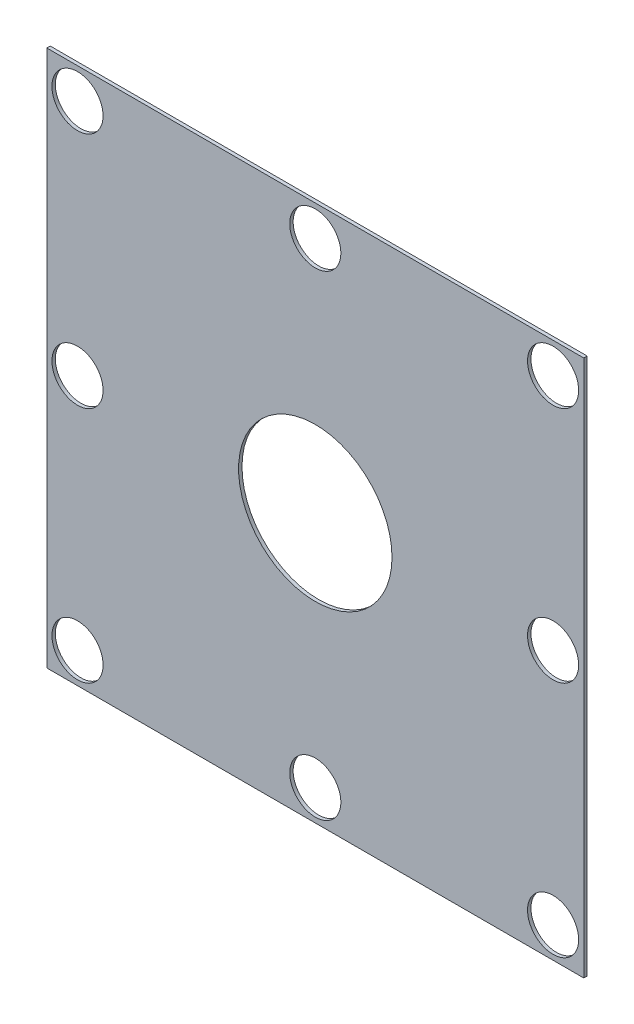
ISO-10303-21;
HEADER;
FILE_DESCRIPTION(('STEP AP214'),'2;1');
FILE_NAME('part.step','',(''),(''),'','','');
FILE_SCHEMA(('AUTOMOTIVE_DESIGN { 1 0 10303 214 1 1 1 1 }'));
ENDSEC;
DATA;
#1=APPLICATION_CONTEXT('core data for automotive mechanical design processes');
#2=APPLICATION_PROTOCOL_DEFINITION('international standard','automotive_design',2000,#1);
#3=PRODUCT_CONTEXT('',#1,'mechanical');
#4=PRODUCT('Part','Part','',(#3));
#5=PRODUCT_RELATED_PRODUCT_CATEGORY('part','',(#4));
#6=PRODUCT_DEFINITION_FORMATION('','',#4);
#7=PRODUCT_DEFINITION_CONTEXT('part definition',#1,'design');
#8=PRODUCT_DEFINITION('design','',#6,#7);
#9=PRODUCT_DEFINITION_SHAPE('','',#8);
#10=(LENGTH_UNIT() NAMED_UNIT(*) SI_UNIT(.MILLI.,.METRE.));
#11=(NAMED_UNIT(*) PLANE_ANGLE_UNIT() SI_UNIT($,.RADIAN.));
#12=(NAMED_UNIT(*) SI_UNIT($,.STERADIAN.) SOLID_ANGLE_UNIT());
#13=UNCERTAINTY_MEASURE_WITH_UNIT(LENGTH_MEASURE(1.E-05),#10,'distance_accuracy_value','');
#14=(GEOMETRIC_REPRESENTATION_CONTEXT(3) GLOBAL_UNCERTAINTY_ASSIGNED_CONTEXT((#13)) GLOBAL_UNIT_ASSIGNED_CONTEXT((#10,
#11,#12)) REPRESENTATION_CONTEXT('',''));
#15=CARTESIAN_POINT('',(0.,0.,0.));
#16=DIRECTION('',(0.,0.,1.));
#17=DIRECTION('',(1.,0.,0.));
#18=AXIS2_PLACEMENT_3D('',#15,#16,#17);
#19=CARTESIAN_POINT('',(0.,0.,0.2));
#20=DIRECTION('',(1.,0.,0.));
#21=DIRECTION('',(0.,0.,-1.));
#22=AXIS2_PLACEMENT_3D('',#19,#20,#21);
#23=PLANE('',#22);
#24=DIRECTION('',(0.,-1.,0.));
#25=VECTOR('',#24,1.);
#26=CARTESIAN_POINT('',(0.,0.,0.));
#27=LINE('',#26,#25);
#28=CARTESIAN_POINT('',(0.,31.5,0.));
#29=VERTEX_POINT('',#28);
#30=CARTESIAN_POINT('',(0.,0.,0.));
#31=VERTEX_POINT('',#30);
#32=EDGE_CURVE('E103',#29,#31,#27,.T.);
#33=ORIENTED_EDGE('',*,*,#32,.T.);
#34=DIRECTION('',(0.,0.,-1.));
#35=VECTOR('',#34,1.);
#36=CARTESIAN_POINT('',(0.,0.,0.2));
#37=LINE('',#36,#35);
#38=CARTESIAN_POINT('',(0.,0.,0.2));
#39=VERTEX_POINT('',#38);
#40=EDGE_CURVE('E11',#39,#31,#37,.T.);
#41=ORIENTED_EDGE('',*,*,#40,.F.);
#42=DIRECTION('',(0.,-1.,0.));
#43=VECTOR('',#42,1.);
#44=CARTESIAN_POINT('',(0.,0.,0.2));
#45=LINE('',#44,#43);
#46=CARTESIAN_POINT('',(0.,31.5,0.2));
#47=VERTEX_POINT('',#46);
#48=EDGE_CURVE('E90',#47,#39,#45,.T.);
#49=ORIENTED_EDGE('',*,*,#48,.F.);
#50=DIRECTION('',(0.,0.,-1.));
#51=VECTOR('',#50,1.);
#52=CARTESIAN_POINT('',(0.,31.5,0.2));
#53=LINE('',#52,#51);
#54=EDGE_CURVE('E99',#47,#29,#53,.T.);
#55=ORIENTED_EDGE('',*,*,#54,.T.);
#56=EDGE_LOOP('',(#33,#41,#49,#55));
#57=FACE_BOUND('',#56,.T.);
#58=ADVANCED_FACE('F38',(#57),#23,.F.);
#59=CARTESIAN_POINT('',(0.,0.,0.2));
#60=DIRECTION('',(0.,1.,0.));
#61=DIRECTION('',(0.,0.,1.));
#62=AXIS2_PLACEMENT_3D('',#59,#60,#61);
#63=PLANE('',#62);
#64=DIRECTION('',(1.,0.,0.));
#65=VECTOR('',#64,1.);
#66=CARTESIAN_POINT('',(0.,0.,0.));
#67=LINE('',#66,#65);
#68=CARTESIAN_POINT('',(31.5,0.,0.));
#69=VERTEX_POINT('',#68);
#70=EDGE_CURVE('E94',#31,#69,#67,.T.);
#71=ORIENTED_EDGE('',*,*,#70,.T.);
#72=DIRECTION('',(0.,0.,-1.));
#73=VECTOR('',#72,1.);
#74=CARTESIAN_POINT('',(31.5,0.,0.2));
#75=LINE('',#74,#73);
#76=CARTESIAN_POINT('',(31.5,0.,0.2));
#77=VERTEX_POINT('',#76);
#78=EDGE_CURVE('E47',#77,#69,#75,.T.);
#79=ORIENTED_EDGE('',*,*,#78,.F.);
#80=DIRECTION('',(1.,0.,0.));
#81=VECTOR('',#80,1.);
#82=CARTESIAN_POINT('',(0.,0.,0.2));
#83=LINE('',#82,#81);
#84=EDGE_CURVE('E85',#39,#77,#83,.T.);
#85=ORIENTED_EDGE('',*,*,#84,.F.);
#86=ORIENTED_EDGE('',*,*,#40,.T.);
#87=EDGE_LOOP('',(#71,#79,#85,#86));
#88=FACE_BOUND('',#87,.T.);
#89=ADVANCED_FACE('F93',(#88),#63,.F.);
#90=CARTESIAN_POINT('',(31.5,0.,0.2));
#91=DIRECTION('',(-1.,0.,0.));
#92=DIRECTION('',(0.,0.,1.));
#93=AXIS2_PLACEMENT_3D('',#90,#91,#92);
#94=PLANE('',#93);
#95=DIRECTION('',(0.,1.,0.));
#96=VECTOR('',#95,1.);
#97=CARTESIAN_POINT('',(31.5,0.,0.));
#98=LINE('',#97,#96);
#99=CARTESIAN_POINT('',(31.5,31.5,0.));
#100=VERTEX_POINT('',#99);
#101=EDGE_CURVE('E72',#69,#100,#98,.T.);
#102=ORIENTED_EDGE('',*,*,#101,.T.);
#103=DIRECTION('',(0.,0.,-1.));
#104=VECTOR('',#103,1.);
#105=CARTESIAN_POINT('',(31.5,31.5,0.2));
#106=LINE('',#105,#104);
#107=CARTESIAN_POINT('',(31.5,31.5,0.2));
#108=VERTEX_POINT('',#107);
#109=EDGE_CURVE('E95',#108,#100,#106,.T.);
#110=ORIENTED_EDGE('',*,*,#109,.F.);
#111=DIRECTION('',(0.,1.,0.));
#112=VECTOR('',#111,1.);
#113=CARTESIAN_POINT('',(31.5,0.,0.2));
#114=LINE('',#113,#112);
#115=EDGE_CURVE('E88',#77,#108,#114,.T.);
#116=ORIENTED_EDGE('',*,*,#115,.F.);
#117=ORIENTED_EDGE('',*,*,#78,.T.);
#118=EDGE_LOOP('',(#102,#110,#116,#117));
#119=FACE_BOUND('',#118,.T.);
#120=ADVANCED_FACE('F97',(#119),#94,.F.);
#121=CARTESIAN_POINT('',(0.,31.5,0.2));
#122=DIRECTION('',(0.,-1.,0.));
#123=DIRECTION('',(0.,0.,-1.));
#124=AXIS2_PLACEMENT_3D('',#121,#122,#123);
#125=PLANE('',#124);
#126=DIRECTION('',(-1.,0.,0.));
#127=VECTOR('',#126,1.);
#128=CARTESIAN_POINT('',(0.,31.5,0.));
#129=LINE('',#128,#127);
#130=EDGE_CURVE('E78',#100,#29,#129,.T.);
#131=ORIENTED_EDGE('',*,*,#130,.T.);
#132=ORIENTED_EDGE('',*,*,#54,.F.);
#133=DIRECTION('',(-1.,0.,0.));
#134=VECTOR('',#133,1.);
#135=CARTESIAN_POINT('',(0.,31.5,0.2));
#136=LINE('',#135,#134);
#137=EDGE_CURVE('E55',#108,#47,#136,.T.);
#138=ORIENTED_EDGE('',*,*,#137,.F.);
#139=ORIENTED_EDGE('',*,*,#109,.T.);
#140=EDGE_LOOP('',(#131,#132,#138,#139));
#141=FACE_BOUND('',#140,.T.);
#142=ADVANCED_FACE('F110',(#141),#125,.F.);
#143=CARTESIAN_POINT('',(0.,0.,0.2));
#144=DIRECTION('',(0.,0.,-1.));
#145=DIRECTION('',(-1.,0.,0.));
#146=AXIS2_PLACEMENT_3D('',#143,#144,#145);
#147=PLANE('',#146);
#148=CARTESIAN_POINT('',(15.75,29.7,0.2));
#149=DIRECTION('',(0.,0.,1.));
#150=DIRECTION('',(1.,0.,0.));
#151=AXIS2_PLACEMENT_3D('',#148,#149,#150);
#152=CIRCLE('',#151,1.5);
#153=CARTESIAN_POINT('',(17.25,29.7,0.2));
#154=VERTEX_POINT('',#153);
#155=EDGE_CURVE('E132',#154,#154,#152,.T.);
#156=ORIENTED_EDGE('',*,*,#155,.F.);
#157=EDGE_LOOP('',(#156));
#158=FACE_BOUND('',#157,.T.);
#159=CARTESIAN_POINT('',(1.8,15.75,0.2));
#160=DIRECTION('',(0.,0.,1.));
#161=DIRECTION('',(1.,0.,0.));
#162=AXIS2_PLACEMENT_3D('',#159,#160,#161);
#163=CIRCLE('',#162,1.5);
#164=CARTESIAN_POINT('',(3.3,15.75,0.2));
#165=VERTEX_POINT('',#164);
#166=EDGE_CURVE('E139',#165,#165,#163,.T.);
#167=ORIENTED_EDGE('',*,*,#166,.F.);
#168=EDGE_LOOP('',(#167));
#169=FACE_BOUND('',#168,.T.);
#170=CARTESIAN_POINT('',(15.75,1.8,0.2));
#171=DIRECTION('',(0.,0.,1.));
#172=DIRECTION('',(1.,0.,0.));
#173=AXIS2_PLACEMENT_3D('',#170,#171,#172);
#174=CIRCLE('',#173,1.5);
#175=CARTESIAN_POINT('',(17.25,1.8,0.2));
#176=VERTEX_POINT('',#175);
#177=EDGE_CURVE('E126',#176,#176,#174,.T.);
#178=ORIENTED_EDGE('',*,*,#177,.F.);
#179=EDGE_LOOP('',(#178));
#180=FACE_BOUND('',#179,.T.);
#181=CARTESIAN_POINT('',(1.8,29.7,0.2));
#182=DIRECTION('',(0.,0.,1.));
#183=DIRECTION('',(1.,0.,0.));
#184=AXIS2_PLACEMENT_3D('',#181,#182,#183);
#185=CIRCLE('',#184,1.5);
#186=CARTESIAN_POINT('',(3.3,29.7,0.2));
#187=VERTEX_POINT('',#186);
#188=EDGE_CURVE('E162',#187,#187,#185,.T.);
#189=ORIENTED_EDGE('',*,*,#188,.F.);
#190=EDGE_LOOP('',(#189));
#191=FACE_BOUND('',#190,.T.);
#192=CARTESIAN_POINT('',(29.7,29.6999999999996,0.2));
#193=DIRECTION('',(0.,0.,1.));
#194=DIRECTION('',(1.,0.,0.));
#195=AXIS2_PLACEMENT_3D('',#192,#193,#194);
#196=CIRCLE('',#195,1.49999999999934);
#197=CARTESIAN_POINT('',(31.1999999999994,29.6999999999996,0.2));
#198=VERTEX_POINT('',#197);
#199=EDGE_CURVE('E156',#198,#198,#196,.T.);
#200=ORIENTED_EDGE('',*,*,#199,.F.);
#201=EDGE_LOOP('',(#200));
#202=FACE_BOUND('',#201,.T.);
#203=CARTESIAN_POINT('',(29.6999999999997,1.79999999999959,0.2));
#204=DIRECTION('',(0.,0.,1.));
#205=DIRECTION('',(1.,0.,0.));
#206=AXIS2_PLACEMENT_3D('',#203,#204,#205);
#207=CIRCLE('',#206,1.49999999999923);
#208=CARTESIAN_POINT('',(31.1999999999989,1.79999999999959,0.2));
#209=VERTEX_POINT('',#208);
#210=EDGE_CURVE('E150',#209,#209,#207,.T.);
#211=ORIENTED_EDGE('',*,*,#210,.F.);
#212=EDGE_LOOP('',(#211));
#213=FACE_BOUND('',#212,.T.);
#214=CARTESIAN_POINT('',(1.79999999999965,1.79999999999994,0.2));
#215=DIRECTION('',(0.,0.,1.));
#216=DIRECTION('',(1.,0.,0.));
#217=AXIS2_PLACEMENT_3D('',#214,#215,#216);
#218=CIRCLE('',#217,1.50000000000002);
#219=CARTESIAN_POINT('',(3.29999999999967,1.79999999999994,0.2));
#220=VERTEX_POINT('',#219);
#221=EDGE_CURVE('E144',#220,#220,#218,.T.);
#222=ORIENTED_EDGE('',*,*,#221,.F.);
#223=EDGE_LOOP('',(#222));
#224=FACE_BOUND('',#223,.T.);
#225=CARTESIAN_POINT('',(29.7,15.75,0.2));
#226=DIRECTION('',(0.,0.,1.));
#227=DIRECTION('',(1.,0.,0.));
#228=AXIS2_PLACEMENT_3D('',#225,#226,#227);
#229=CIRCLE('',#228,1.5);
#230=CARTESIAN_POINT('',(31.2,15.75,0.2));
#231=VERTEX_POINT('',#230);
#232=EDGE_CURVE('E120',#231,#231,#229,.T.);
#233=ORIENTED_EDGE('',*,*,#232,.F.);
#234=EDGE_LOOP('',(#233));
#235=FACE_BOUND('',#234,.T.);
#236=CARTESIAN_POINT('',(15.75,15.75,0.2));
#237=DIRECTION('',(0.,0.,1.));
#238=DIRECTION('',(1.,0.,0.));
#239=AXIS2_PLACEMENT_3D('',#236,#237,#238);
#240=CIRCLE('',#239,4.5);
#241=CARTESIAN_POINT('',(20.25,15.75,0.2));
#242=VERTEX_POINT('',#241);
#243=EDGE_CURVE('E116',#242,#242,#240,.T.);
#244=ORIENTED_EDGE('',*,*,#243,.F.);
#245=EDGE_LOOP('',(#244));
#246=FACE_BOUND('',#245,.T.);
#247=ORIENTED_EDGE('',*,*,#48,.T.);
#248=ORIENTED_EDGE('',*,*,#84,.T.);
#249=ORIENTED_EDGE('',*,*,#115,.T.);
#250=ORIENTED_EDGE('',*,*,#137,.T.);
#251=EDGE_LOOP('',(#247,#248,#249,#250));
#252=FACE_BOUND('',#251,.T.);
#253=ADVANCED_FACE('F86',(#158,#169,#180,#191,#202,#213,#224,#235,#246,#252),#147,.F.);
#254=CARTESIAN_POINT('',(0.,0.,0.));
#255=DIRECTION('',(0.,0.,-1.));
#256=DIRECTION('',(-1.,0.,0.));
#257=AXIS2_PLACEMENT_3D('',#254,#255,#256);
#258=PLANE('',#257);
#259=CARTESIAN_POINT('',(15.75,29.7,0.));
#260=DIRECTION('',(0.,0.,1.));
#261=DIRECTION('',(1.,0.,0.));
#262=AXIS2_PLACEMENT_3D('',#259,#260,#261);
#263=CIRCLE('',#262,1.5);
#264=CARTESIAN_POINT('',(17.25,29.7,0.));
#265=VERTEX_POINT('',#264);
#266=EDGE_CURVE('E135',#265,#265,#263,.T.);
#267=ORIENTED_EDGE('',*,*,#266,.T.);
#268=EDGE_LOOP('',(#267));
#269=FACE_BOUND('',#268,.T.);
#270=CARTESIAN_POINT('',(1.8,15.75,0.));
#271=DIRECTION('',(0.,0.,1.));
#272=DIRECTION('',(1.,0.,0.));
#273=AXIS2_PLACEMENT_3D('',#270,#271,#272);
#274=CIRCLE('',#273,1.5);
#275=CARTESIAN_POINT('',(3.3,15.75,0.));
#276=VERTEX_POINT('',#275);
#277=EDGE_CURVE('E129',#276,#276,#274,.T.);
#278=ORIENTED_EDGE('',*,*,#277,.T.);
#279=EDGE_LOOP('',(#278));
#280=FACE_BOUND('',#279,.T.);
#281=CARTESIAN_POINT('',(15.75,1.8,0.));
#282=DIRECTION('',(0.,0.,1.));
#283=DIRECTION('',(1.,0.,0.));
#284=AXIS2_PLACEMENT_3D('',#281,#282,#283);
#285=CIRCLE('',#284,1.5);
#286=CARTESIAN_POINT('',(17.25,1.8,0.));
#287=VERTEX_POINT('',#286);
#288=EDGE_CURVE('E123',#287,#287,#285,.T.);
#289=ORIENTED_EDGE('',*,*,#288,.T.);
#290=EDGE_LOOP('',(#289));
#291=FACE_BOUND('',#290,.T.);
#292=CARTESIAN_POINT('',(1.8,29.7,0.));
#293=DIRECTION('',(0.,0.,1.));
#294=DIRECTION('',(1.,0.,0.));
#295=AXIS2_PLACEMENT_3D('',#292,#293,#294);
#296=CIRCLE('',#295,1.5);
#297=CARTESIAN_POINT('',(3.3,29.7,0.));
#298=VERTEX_POINT('',#297);
#299=EDGE_CURVE('E136',#298,#298,#296,.T.);
#300=ORIENTED_EDGE('',*,*,#299,.T.);
#301=EDGE_LOOP('',(#300));
#302=FACE_BOUND('',#301,.T.);
#303=CARTESIAN_POINT('',(29.7,29.6999999999996,0.));
#304=DIRECTION('',(0.,0.,1.));
#305=DIRECTION('',(1.,0.,0.));
#306=AXIS2_PLACEMENT_3D('',#303,#304,#305);
#307=CIRCLE('',#306,1.49999999999934);
#308=CARTESIAN_POINT('',(31.1999999999994,29.6999999999996,0.));
#309=VERTEX_POINT('',#308);
#310=EDGE_CURVE('E159',#309,#309,#307,.T.);
#311=ORIENTED_EDGE('',*,*,#310,.T.);
#312=EDGE_LOOP('',(#311));
#313=FACE_BOUND('',#312,.T.);
#314=CARTESIAN_POINT('',(29.6999999999997,1.79999999999959,0.));
#315=DIRECTION('',(0.,0.,1.));
#316=DIRECTION('',(1.,0.,0.));
#317=AXIS2_PLACEMENT_3D('',#314,#315,#316);
#318=CIRCLE('',#317,1.49999999999923);
#319=CARTESIAN_POINT('',(31.1999999999989,1.79999999999959,0.));
#320=VERTEX_POINT('',#319);
#321=EDGE_CURVE('E153',#320,#320,#318,.T.);
#322=ORIENTED_EDGE('',*,*,#321,.T.);
#323=EDGE_LOOP('',(#322));
#324=FACE_BOUND('',#323,.T.);
#325=CARTESIAN_POINT('',(1.79999999999965,1.79999999999994,0.));
#326=DIRECTION('',(0.,0.,1.));
#327=DIRECTION('',(1.,0.,0.));
#328=AXIS2_PLACEMENT_3D('',#325,#326,#327);
#329=CIRCLE('',#328,1.50000000000002);
#330=CARTESIAN_POINT('',(3.29999999999967,1.79999999999994,0.));
#331=VERTEX_POINT('',#330);
#332=EDGE_CURVE('E147',#331,#331,#329,.T.);
#333=ORIENTED_EDGE('',*,*,#332,.T.);
#334=EDGE_LOOP('',(#333));
#335=FACE_BOUND('',#334,.T.);
#336=CARTESIAN_POINT('',(29.7,15.75,0.));
#337=DIRECTION('',(0.,0.,1.));
#338=DIRECTION('',(1.,0.,0.));
#339=AXIS2_PLACEMENT_3D('',#336,#337,#338);
#340=CIRCLE('',#339,1.5);
#341=CARTESIAN_POINT('',(31.2,15.75,0.));
#342=VERTEX_POINT('',#341);
#343=EDGE_CURVE('E119',#342,#342,#340,.T.);
#344=ORIENTED_EDGE('',*,*,#343,.T.);
#345=EDGE_LOOP('',(#344));
#346=FACE_BOUND('',#345,.T.);
#347=CARTESIAN_POINT('',(15.75,15.75,0.));
#348=DIRECTION('',(0.,0.,-1.));
#349=DIRECTION('',(-1.,0.,0.));
#350=AXIS2_PLACEMENT_3D('',#347,#348,#349);
#351=CIRCLE('',#350,4.5);
#352=CARTESIAN_POINT('',(11.25,15.75,0.));
#353=VERTEX_POINT('',#352);
#354=EDGE_CURVE('E41',#353,#353,#351,.T.);
#355=ORIENTED_EDGE('',*,*,#354,.F.);
#356=EDGE_LOOP('',(#355));
#357=FACE_BOUND('',#356,.T.);
#358=ORIENTED_EDGE('',*,*,#32,.F.);
#359=ORIENTED_EDGE('',*,*,#130,.F.);
#360=ORIENTED_EDGE('',*,*,#101,.F.);
#361=ORIENTED_EDGE('',*,*,#70,.F.);
#362=EDGE_LOOP('',(#358,#359,#360,#361));
#363=FACE_BOUND('',#362,.T.);
#364=ADVANCED_FACE('F113',(#269,#280,#291,#302,#313,#324,#335,#346,#357,#363),#258,.T.);
#365=CARTESIAN_POINT('',(15.75,15.75,-9.8));
#366=DIRECTION('',(0.,0.,1.));
#367=DIRECTION('',(1.,0.,0.));
#368=AXIS2_PLACEMENT_3D('',#365,#366,#367);
#369=CYLINDRICAL_SURFACE('',#368,4.5);
#370=ORIENTED_EDGE('',*,*,#354,.T.);
#371=EDGE_LOOP('',(#370));
#372=FACE_BOUND('',#371,.T.);
#373=ORIENTED_EDGE('',*,*,#243,.T.);
#374=EDGE_LOOP('',(#373));
#375=FACE_BOUND('',#374,.T.);
#376=ADVANCED_FACE('F192',(#372,#375),#369,.F.);
#377=CARTESIAN_POINT('',(29.7,15.75,0.));
#378=DIRECTION('',(0.,0.,1.));
#379=DIRECTION('',(1.,0.,0.));
#380=AXIS2_PLACEMENT_3D('',#377,#378,#379);
#381=CYLINDRICAL_SURFACE('',#380,1.5);
#382=ORIENTED_EDGE('',*,*,#343,.F.);
#383=EDGE_LOOP('',(#382));
#384=FACE_BOUND('',#383,.T.);
#385=ORIENTED_EDGE('',*,*,#232,.T.);
#386=EDGE_LOOP('',(#385));
#387=FACE_BOUND('',#386,.T.);
#388=ADVANCED_FACE('F194',(#384,#387),#381,.F.);
#389=CARTESIAN_POINT('',(1.79999999999965,1.79999999999994,0.));
#390=DIRECTION('',(0.,0.,1.));
#391=DIRECTION('',(1.,0.,0.));
#392=AXIS2_PLACEMENT_3D('',#389,#390,#391);
#393=CYLINDRICAL_SURFACE('',#392,1.50000000000002);
#394=ORIENTED_EDGE('',*,*,#332,.F.);
#395=EDGE_LOOP('',(#394));
#396=FACE_BOUND('',#395,.T.);
#397=ORIENTED_EDGE('',*,*,#221,.T.);
#398=EDGE_LOOP('',(#397));
#399=FACE_BOUND('',#398,.T.);
#400=ADVANCED_FACE('F201',(#396,#399),#393,.F.);
#401=CARTESIAN_POINT('',(29.6999999999997,1.79999999999959,0.));
#402=DIRECTION('',(0.,0.,1.));
#403=DIRECTION('',(1.,0.,0.));
#404=AXIS2_PLACEMENT_3D('',#401,#402,#403);
#405=CYLINDRICAL_SURFACE('',#404,1.49999999999923);
#406=ORIENTED_EDGE('',*,*,#321,.F.);
#407=EDGE_LOOP('',(#406));
#408=FACE_BOUND('',#407,.T.);
#409=ORIENTED_EDGE('',*,*,#210,.T.);
#410=EDGE_LOOP('',(#409));
#411=FACE_BOUND('',#410,.T.);
#412=ADVANCED_FACE('F247',(#408,#411),#405,.F.);
#413=CARTESIAN_POINT('',(29.7,29.6999999999996,0.));
#414=DIRECTION('',(0.,0.,1.));
#415=DIRECTION('',(1.,0.,0.));
#416=AXIS2_PLACEMENT_3D('',#413,#414,#415);
#417=CYLINDRICAL_SURFACE('',#416,1.49999999999934);
#418=ORIENTED_EDGE('',*,*,#310,.F.);
#419=EDGE_LOOP('',(#418));
#420=FACE_BOUND('',#419,.T.);
#421=ORIENTED_EDGE('',*,*,#199,.T.);
#422=EDGE_LOOP('',(#421));
#423=FACE_BOUND('',#422,.T.);
#424=ADVANCED_FACE('F174',(#420,#423),#417,.F.);
#425=CARTESIAN_POINT('',(1.8,29.7,0.));
#426=DIRECTION('',(0.,0.,1.));
#427=DIRECTION('',(1.,0.,0.));
#428=AXIS2_PLACEMENT_3D('',#425,#426,#427);
#429=CYLINDRICAL_SURFACE('',#428,1.5);
#430=ORIENTED_EDGE('',*,*,#299,.F.);
#431=EDGE_LOOP('',(#430));
#432=FACE_BOUND('',#431,.T.);
#433=ORIENTED_EDGE('',*,*,#188,.T.);
#434=EDGE_LOOP('',(#433));
#435=FACE_BOUND('',#434,.T.);
#436=ADVANCED_FACE('F170',(#432,#435),#429,.F.);
#437=CARTESIAN_POINT('',(15.75,1.8,0.));
#438=DIRECTION('',(0.,0.,1.));
#439=DIRECTION('',(1.,0.,0.));
#440=AXIS2_PLACEMENT_3D('',#437,#438,#439);
#441=CYLINDRICAL_SURFACE('',#440,1.5);
#442=ORIENTED_EDGE('',*,*,#288,.F.);
#443=EDGE_LOOP('',(#442));
#444=FACE_BOUND('',#443,.T.);
#445=ORIENTED_EDGE('',*,*,#177,.T.);
#446=EDGE_LOOP('',(#445));
#447=FACE_BOUND('',#446,.T.);
#448=ADVANCED_FACE('F173',(#444,#447),#441,.F.);
#449=CARTESIAN_POINT('',(1.8,15.75,0.));
#450=DIRECTION('',(0.,0.,1.));
#451=DIRECTION('',(1.,0.,0.));
#452=AXIS2_PLACEMENT_3D('',#449,#450,#451);
#453=CYLINDRICAL_SURFACE('',#452,1.5);
#454=ORIENTED_EDGE('',*,*,#277,.F.);
#455=EDGE_LOOP('',(#454));
#456=FACE_BOUND('',#455,.T.);
#457=ORIENTED_EDGE('',*,*,#166,.T.);
#458=EDGE_LOOP('',(#457));
#459=FACE_BOUND('',#458,.T.);
#460=ADVANCED_FACE('F281',(#456,#459),#453,.F.);
#461=CARTESIAN_POINT('',(15.75,29.7,0.));
#462=DIRECTION('',(0.,0.,1.));
#463=DIRECTION('',(1.,0.,0.));
#464=AXIS2_PLACEMENT_3D('',#461,#462,#463);
#465=CYLINDRICAL_SURFACE('',#464,1.5);
#466=ORIENTED_EDGE('',*,*,#266,.F.);
#467=EDGE_LOOP('',(#466));
#468=FACE_BOUND('',#467,.T.);
#469=ORIENTED_EDGE('',*,*,#155,.T.);
#470=EDGE_LOOP('',(#469));
#471=FACE_BOUND('',#470,.T.);
#472=ADVANCED_FACE('F291',(#468,#471),#465,.F.);
#473=CLOSED_SHELL('',(#58,#89,#120,#142,#253,#364,#376,#388,#400,#412,#424,#436,#448,#460,#472));
#474=MANIFOLD_SOLID_BREP('B2',#473);
#475=ADVANCED_BREP_SHAPE_REPRESENTATION('',(#18,#474),#14);
#476=SHAPE_DEFINITION_REPRESENTATION(#9,#475);
ENDSEC;
END-ISO-10303-21;
